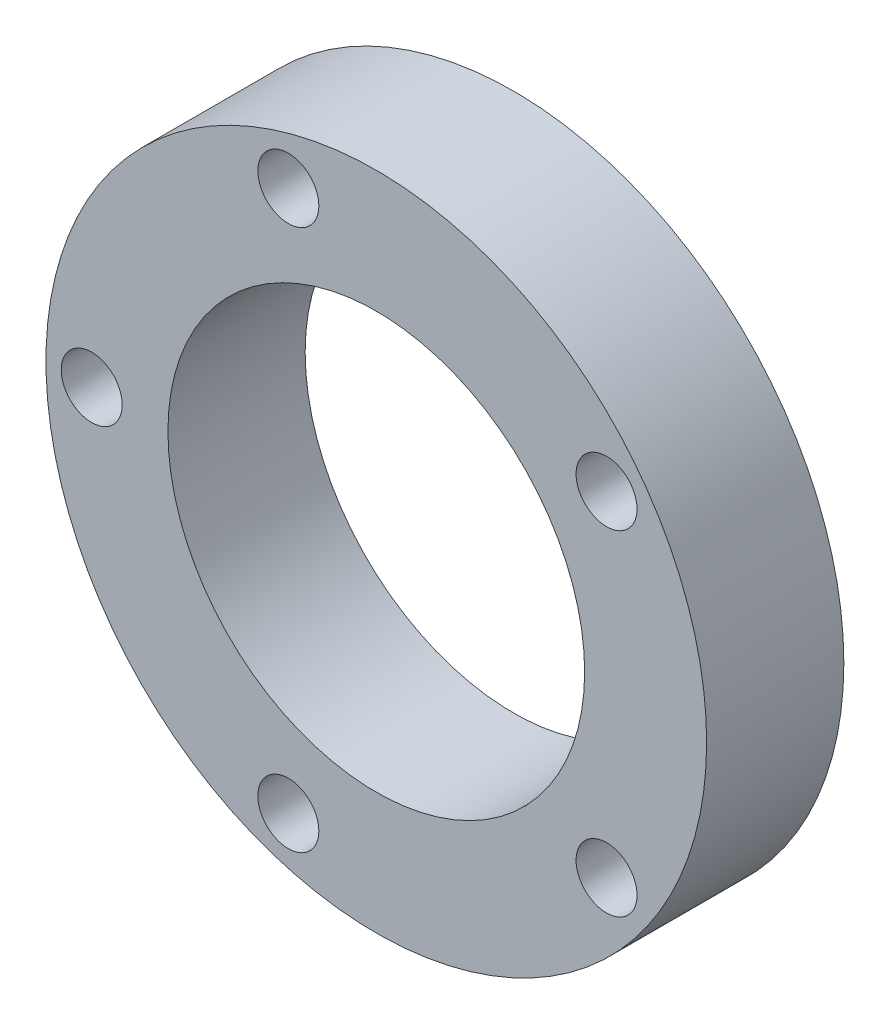
ISO-10303-21;
HEADER;
FILE_DESCRIPTION(('STEP AP214'),'2;1');
FILE_NAME('part.step','',(''),(''),'','','');
FILE_SCHEMA(('AUTOMOTIVE_DESIGN { 1 0 10303 214 1 1 1 1 }'));
ENDSEC;
DATA;
#1=APPLICATION_CONTEXT('core data for automotive mechanical design processes');
#2=APPLICATION_PROTOCOL_DEFINITION('international standard','automotive_design',2000,#1);
#3=PRODUCT_CONTEXT('',#1,'mechanical');
#4=PRODUCT('Part','Part','',(#3));
#5=PRODUCT_RELATED_PRODUCT_CATEGORY('part','',(#4));
#6=PRODUCT_DEFINITION_FORMATION('','',#4);
#7=PRODUCT_DEFINITION_CONTEXT('part definition',#1,'design');
#8=PRODUCT_DEFINITION('design','',#6,#7);
#9=PRODUCT_DEFINITION_SHAPE('','',#8);
#10=(LENGTH_UNIT() NAMED_UNIT(*) SI_UNIT(.MILLI.,.METRE.));
#11=(NAMED_UNIT(*) PLANE_ANGLE_UNIT() SI_UNIT($,.RADIAN.));
#12=(NAMED_UNIT(*) SI_UNIT($,.STERADIAN.) SOLID_ANGLE_UNIT());
#13=UNCERTAINTY_MEASURE_WITH_UNIT(LENGTH_MEASURE(1.E-05),#10,'distance_accuracy_value','');
#14=(GEOMETRIC_REPRESENTATION_CONTEXT(3) GLOBAL_UNCERTAINTY_ASSIGNED_CONTEXT((#13)) GLOBAL_UNIT_ASSIGNED_CONTEXT((#10,
#11,#12)) REPRESENTATION_CONTEXT('',''));
#15=CARTESIAN_POINT('',(0.,0.,0.));
#16=DIRECTION('',(0.,0.,1.));
#17=DIRECTION('',(1.,0.,0.));
#18=AXIS2_PLACEMENT_3D('',#15,#16,#17);
#19=CARTESIAN_POINT('',(0.,0.,27.));
#20=DIRECTION('',(0.,0.,-1.));
#21=DIRECTION('',(-1.,0.,0.));
#22=AXIS2_PLACEMENT_3D('',#19,#20,#21);
#23=CYLINDRICAL_SURFACE('',#22,65.);
#24=CARTESIAN_POINT('',(0.,0.,27.));
#25=DIRECTION('',(0.,0.,1.));
#26=DIRECTION('',(1.,0.,0.));
#27=AXIS2_PLACEMENT_3D('',#24,#25,#26);
#28=CIRCLE('',#27,65.);
#29=CARTESIAN_POINT('',(65.,0.,27.));
#30=VERTEX_POINT('',#29);
#31=EDGE_CURVE('E10',#30,#30,#28,.T.);
#32=ORIENTED_EDGE('',*,*,#31,.F.);
#33=EDGE_LOOP('',(#32));
#34=FACE_BOUND('',#33,.T.);
#35=CARTESIAN_POINT('',(0.,0.,0.));
#36=DIRECTION('',(0.,0.,1.));
#37=DIRECTION('',(1.,0.,0.));
#38=AXIS2_PLACEMENT_3D('',#35,#36,#37);
#39=CIRCLE('',#38,65.);
#40=CARTESIAN_POINT('',(65.,0.,0.));
#41=VERTEX_POINT('',#40);
#42=EDGE_CURVE('E39',#41,#41,#39,.T.);
#43=ORIENTED_EDGE('',*,*,#42,.T.);
#44=EDGE_LOOP('',(#43));
#45=FACE_BOUND('',#44,.T.);
#46=ADVANCED_FACE('F32',(#34,#45),#23,.T.);
#47=CARTESIAN_POINT('',(0.,0.,27.));
#48=DIRECTION('',(0.,0.,1.));
#49=DIRECTION('',(1.,0.,0.));
#50=AXIS2_PLACEMENT_3D('',#47,#48,#49);
#51=PLANE('',#50);
#52=CARTESIAN_POINT('',(-56.,0.,27.));
#53=DIRECTION('',(0.,0.,1.));
#54=DIRECTION('',(1.,0.,0.));
#55=AXIS2_PLACEMENT_3D('',#52,#53,#54);
#56=CIRCLE('',#55,6.00000000000001);
#57=CARTESIAN_POINT('',(-50.,0.,27.));
#58=VERTEX_POINT('',#57);
#59=EDGE_CURVE('E53',#58,#58,#56,.T.);
#60=ORIENTED_EDGE('',*,*,#59,.F.);
#61=EDGE_LOOP('',(#60));
#62=FACE_BOUND('',#61,.T.);
#63=CARTESIAN_POINT('',(45.3049516849968,-32.9159741283789,27.));
#64=DIRECTION('',(0.,0.,1.));
#65=DIRECTION('',(1.,0.,0.));
#66=AXIS2_PLACEMENT_3D('',#63,#64,#65);
#67=CIRCLE('',#66,6.00000000000001);
#68=CARTESIAN_POINT('',(51.3049516849968,-32.9159741283789,27.));
#69=VERTEX_POINT('',#68);
#70=EDGE_CURVE('E130',#69,#69,#67,.T.);
#71=ORIENTED_EDGE('',*,*,#70,.F.);
#72=EDGE_LOOP('',(#71));
#73=FACE_BOUND('',#72,.T.);
#74=CARTESIAN_POINT('',(45.3049516849972,32.9159741283782,27.));
#75=DIRECTION('',(0.,0.,1.));
#76=DIRECTION('',(1.,0.,0.));
#77=AXIS2_PLACEMENT_3D('',#74,#75,#76);
#78=CIRCLE('',#77,6.00000000000001);
#79=CARTESIAN_POINT('',(51.3049516849972,32.9159741283782,27.));
#80=VERTEX_POINT('',#79);
#81=EDGE_CURVE('E116',#80,#80,#78,.T.);
#82=ORIENTED_EDGE('',*,*,#81,.F.);
#83=EDGE_LOOP('',(#82));
#84=FACE_BOUND('',#83,.T.);
#85=CARTESIAN_POINT('',(-17.3049516849969,53.2591649125287,27.));
#86=DIRECTION('',(0.,0.,1.));
#87=DIRECTION('',(1.,0.,0.));
#88=AXIS2_PLACEMENT_3D('',#85,#86,#87);
#89=CIRCLE('',#88,6.00000000000001);
#90=CARTESIAN_POINT('',(-11.3049516849969,53.2591649125287,27.));
#91=VERTEX_POINT('',#90);
#92=EDGE_CURVE('E129',#91,#91,#89,.T.);
#93=ORIENTED_EDGE('',*,*,#92,.F.);
#94=EDGE_LOOP('',(#93));
#95=FACE_BOUND('',#94,.T.);
#96=CARTESIAN_POINT('',(0.,0.,27.));
#97=DIRECTION('',(0.,0.,1.));
#98=DIRECTION('',(1.,0.,0.));
#99=AXIS2_PLACEMENT_3D('',#96,#97,#98);
#100=CIRCLE('',#99,41.);
#101=CARTESIAN_POINT('',(41.,0.,27.));
#102=VERTEX_POINT('',#101);
#103=EDGE_CURVE('E133',#102,#102,#100,.T.);
#104=ORIENTED_EDGE('',*,*,#103,.F.);
#105=EDGE_LOOP('',(#104));
#106=FACE_BOUND('',#105,.T.);
#107=CARTESIAN_POINT('',(-17.3049516849977,-53.2591649125284,27.));
#108=DIRECTION('',(0.,0.,1.));
#109=DIRECTION('',(1.,0.,0.));
#110=AXIS2_PLACEMENT_3D('',#107,#108,#109);
#111=CIRCLE('',#110,6.);
#112=CARTESIAN_POINT('',(-11.3049516849977,-53.2591649125284,27.));
#113=VERTEX_POINT('',#112);
#114=EDGE_CURVE('E46',#113,#113,#111,.T.);
#115=ORIENTED_EDGE('',*,*,#114,.F.);
#116=EDGE_LOOP('',(#115));
#117=FACE_BOUND('',#116,.T.);
#118=ORIENTED_EDGE('',*,*,#31,.T.);
#119=EDGE_LOOP('',(#118));
#120=FACE_BOUND('',#119,.T.);
#121=ADVANCED_FACE('F84',(#62,#73,#84,#95,#106,#117,#120),#51,.T.);
#122=CARTESIAN_POINT('',(0.,0.,0.));
#123=DIRECTION('',(0.,0.,1.));
#124=DIRECTION('',(1.,0.,0.));
#125=AXIS2_PLACEMENT_3D('',#122,#123,#124);
#126=PLANE('',#125);
#127=CARTESIAN_POINT('',(-56.,0.,0.));
#128=DIRECTION('',(0.,0.,1.));
#129=DIRECTION('',(1.,0.,0.));
#130=AXIS2_PLACEMENT_3D('',#127,#128,#129);
#131=CIRCLE('',#130,6.00000000000001);
#132=CARTESIAN_POINT('',(-50.,0.,0.));
#133=VERTEX_POINT('',#132);
#134=EDGE_CURVE('E35',#133,#133,#131,.T.);
#135=ORIENTED_EDGE('',*,*,#134,.T.);
#136=EDGE_LOOP('',(#135));
#137=FACE_BOUND('',#136,.T.);
#138=CARTESIAN_POINT('',(45.3049516849968,-32.9159741283789,0.));
#139=DIRECTION('',(0.,0.,1.));
#140=DIRECTION('',(1.,0.,0.));
#141=AXIS2_PLACEMENT_3D('',#138,#139,#140);
#142=CIRCLE('',#141,6.00000000000001);
#143=CARTESIAN_POINT('',(51.3049516849968,-32.9159741283789,0.));
#144=VERTEX_POINT('',#143);
#145=EDGE_CURVE('E61',#144,#144,#142,.T.);
#146=ORIENTED_EDGE('',*,*,#145,.T.);
#147=EDGE_LOOP('',(#146));
#148=FACE_BOUND('',#147,.T.);
#149=CARTESIAN_POINT('',(45.3049516849972,32.9159741283782,0.));
#150=DIRECTION('',(0.,0.,1.));
#151=DIRECTION('',(1.,0.,0.));
#152=AXIS2_PLACEMENT_3D('',#149,#150,#151);
#153=CIRCLE('',#152,6.00000000000001);
#154=CARTESIAN_POINT('',(51.3049516849972,32.9159741283782,0.));
#155=VERTEX_POINT('',#154);
#156=EDGE_CURVE('E59',#155,#155,#153,.T.);
#157=ORIENTED_EDGE('',*,*,#156,.T.);
#158=EDGE_LOOP('',(#157));
#159=FACE_BOUND('',#158,.T.);
#160=CARTESIAN_POINT('',(-17.3049516849969,53.2591649125287,0.));
#161=DIRECTION('',(0.,0.,1.));
#162=DIRECTION('',(1.,0.,0.));
#163=AXIS2_PLACEMENT_3D('',#160,#161,#162);
#164=CIRCLE('',#163,6.00000000000001);
#165=CARTESIAN_POINT('',(-11.3049516849969,53.2591649125287,0.));
#166=VERTEX_POINT('',#165);
#167=EDGE_CURVE('E56',#166,#166,#164,.T.);
#168=ORIENTED_EDGE('',*,*,#167,.T.);
#169=EDGE_LOOP('',(#168));
#170=FACE_BOUND('',#169,.T.);
#171=CARTESIAN_POINT('',(0.,0.,0.));
#172=DIRECTION('',(0.,0.,1.));
#173=DIRECTION('',(1.,0.,0.));
#174=AXIS2_PLACEMENT_3D('',#171,#172,#173);
#175=CIRCLE('',#174,41.);
#176=CARTESIAN_POINT('',(41.,0.,0.));
#177=VERTEX_POINT('',#176);
#178=EDGE_CURVE('E52',#177,#177,#175,.T.);
#179=ORIENTED_EDGE('',*,*,#178,.T.);
#180=EDGE_LOOP('',(#179));
#181=FACE_BOUND('',#180,.T.);
#182=CARTESIAN_POINT('',(-17.3049516849977,-53.2591649125284,0.));
#183=DIRECTION('',(0.,0.,1.));
#184=DIRECTION('',(1.,0.,0.));
#185=AXIS2_PLACEMENT_3D('',#182,#183,#184);
#186=CIRCLE('',#185,6.);
#187=CARTESIAN_POINT('',(-11.3049516849977,-53.2591649125284,0.));
#188=VERTEX_POINT('',#187);
#189=EDGE_CURVE('E49',#188,#188,#186,.T.);
#190=ORIENTED_EDGE('',*,*,#189,.T.);
#191=EDGE_LOOP('',(#190));
#192=FACE_BOUND('',#191,.T.);
#193=ORIENTED_EDGE('',*,*,#42,.F.);
#194=EDGE_LOOP('',(#193));
#195=FACE_BOUND('',#194,.T.);
#196=ADVANCED_FACE('F68',(#137,#148,#159,#170,#181,#192,#195),#126,.F.);
#197=CARTESIAN_POINT('',(-17.3049516849977,-53.2591649125284,-8.));
#198=DIRECTION('',(0.,0.,1.));
#199=DIRECTION('',(1.,0.,0.));
#200=AXIS2_PLACEMENT_3D('',#197,#198,#199);
#201=CYLINDRICAL_SURFACE('',#200,6.);
#202=ORIENTED_EDGE('',*,*,#114,.T.);
#203=EDGE_LOOP('',(#202));
#204=FACE_BOUND('',#203,.T.);
#205=ORIENTED_EDGE('',*,*,#189,.F.);
#206=EDGE_LOOP('',(#205));
#207=FACE_BOUND('',#206,.T.);
#208=ADVANCED_FACE('F95',(#204,#207),#201,.F.);
#209=CARTESIAN_POINT('',(0.,0.,-8.));
#210=DIRECTION('',(0.,0.,1.));
#211=DIRECTION('',(1.,0.,0.));
#212=AXIS2_PLACEMENT_3D('',#209,#210,#211);
#213=CYLINDRICAL_SURFACE('',#212,41.);
#214=ORIENTED_EDGE('',*,*,#103,.T.);
#215=EDGE_LOOP('',(#214));
#216=FACE_BOUND('',#215,.T.);
#217=ORIENTED_EDGE('',*,*,#178,.F.);
#218=EDGE_LOOP('',(#217));
#219=FACE_BOUND('',#218,.T.);
#220=ADVANCED_FACE('F99',(#216,#219),#213,.F.);
#221=CARTESIAN_POINT('',(-17.3049516849969,53.2591649125287,-8.));
#222=DIRECTION('',(0.,0.,1.));
#223=DIRECTION('',(1.,0.,0.));
#224=AXIS2_PLACEMENT_3D('',#221,#222,#223);
#225=CYLINDRICAL_SURFACE('',#224,6.00000000000001);
#226=ORIENTED_EDGE('',*,*,#92,.T.);
#227=EDGE_LOOP('',(#226));
#228=FACE_BOUND('',#227,.T.);
#229=ORIENTED_EDGE('',*,*,#167,.F.);
#230=EDGE_LOOP('',(#229));
#231=FACE_BOUND('',#230,.T.);
#232=ADVANCED_FACE('F103',(#228,#231),#225,.F.);
#233=CARTESIAN_POINT('',(45.3049516849972,32.9159741283782,-8.));
#234=DIRECTION('',(0.,0.,1.));
#235=DIRECTION('',(1.,0.,0.));
#236=AXIS2_PLACEMENT_3D('',#233,#234,#235);
#237=CYLINDRICAL_SURFACE('',#236,6.00000000000001);
#238=ORIENTED_EDGE('',*,*,#81,.T.);
#239=EDGE_LOOP('',(#238));
#240=FACE_BOUND('',#239,.T.);
#241=ORIENTED_EDGE('',*,*,#156,.F.);
#242=EDGE_LOOP('',(#241));
#243=FACE_BOUND('',#242,.T.);
#244=ADVANCED_FACE('F78',(#240,#243),#237,.F.);
#245=CARTESIAN_POINT('',(45.3049516849968,-32.9159741283789,-8.));
#246=DIRECTION('',(0.,0.,1.));
#247=DIRECTION('',(1.,0.,0.));
#248=AXIS2_PLACEMENT_3D('',#245,#246,#247);
#249=CYLINDRICAL_SURFACE('',#248,6.00000000000001);
#250=ORIENTED_EDGE('',*,*,#70,.T.);
#251=EDGE_LOOP('',(#250));
#252=FACE_BOUND('',#251,.T.);
#253=ORIENTED_EDGE('',*,*,#145,.F.);
#254=EDGE_LOOP('',(#253));
#255=FACE_BOUND('',#254,.T.);
#256=ADVANCED_FACE('F72',(#252,#255),#249,.F.);
#257=CARTESIAN_POINT('',(-56.,0.,-8.));
#258=DIRECTION('',(0.,0.,1.));
#259=DIRECTION('',(1.,0.,0.));
#260=AXIS2_PLACEMENT_3D('',#257,#258,#259);
#261=CYLINDRICAL_SURFACE('',#260,6.00000000000001);
#262=ORIENTED_EDGE('',*,*,#59,.T.);
#263=EDGE_LOOP('',(#262));
#264=FACE_BOUND('',#263,.T.);
#265=ORIENTED_EDGE('',*,*,#134,.F.);
#266=EDGE_LOOP('',(#265));
#267=FACE_BOUND('',#266,.T.);
#268=ADVANCED_FACE('F70',(#264,#267),#261,.F.);
#269=CLOSED_SHELL('',(#46,#121,#196,#208,#220,#232,#244,#256,#268));
#270=MANIFOLD_SOLID_BREP('B2',#269);
#271=ADVANCED_BREP_SHAPE_REPRESENTATION('',(#18,#270),#14);
#272=SHAPE_DEFINITION_REPRESENTATION(#9,#271);
ENDSEC;
END-ISO-10303-21;
